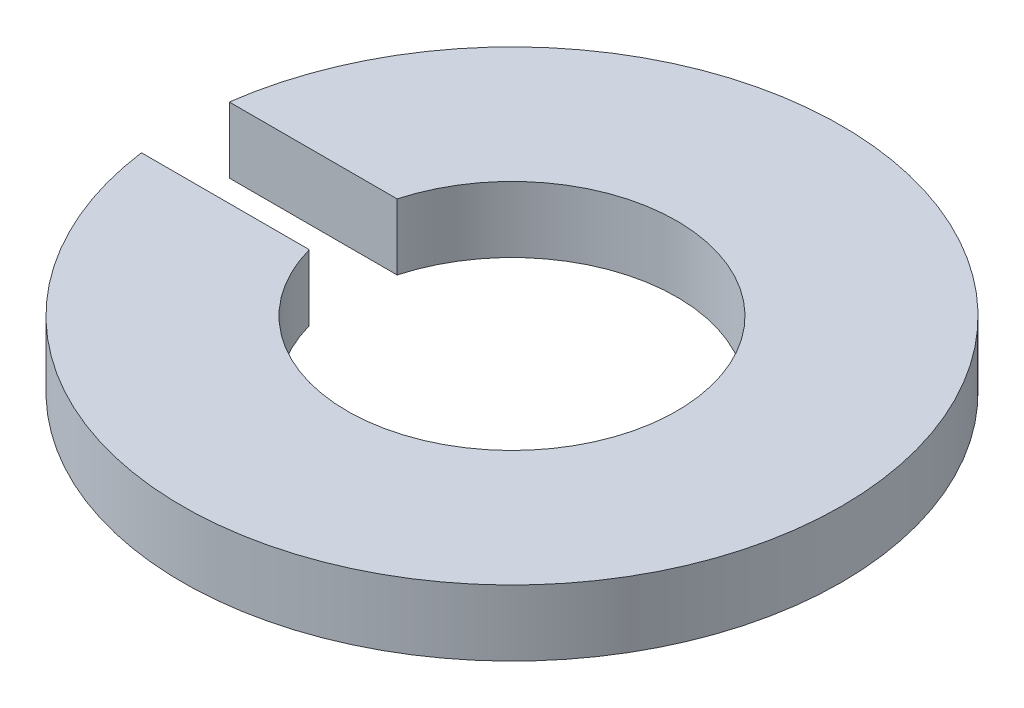
ISO-10303-21;
HEADER;
FILE_DESCRIPTION(('STEP AP214'),'2;1');
FILE_NAME('part.step','',(''),(''),'','','');
FILE_SCHEMA(('AUTOMOTIVE_DESIGN { 1 0 10303 214 1 1 1 1 }'));
ENDSEC;
DATA;
#1=APPLICATION_CONTEXT('core data for automotive mechanical design processes');
#2=APPLICATION_PROTOCOL_DEFINITION('international standard','automotive_design',2000,#1);
#3=PRODUCT_CONTEXT('',#1,'mechanical');
#4=PRODUCT('Part','Part','',(#3));
#5=PRODUCT_RELATED_PRODUCT_CATEGORY('part','',(#4));
#6=PRODUCT_DEFINITION_FORMATION('','',#4);
#7=PRODUCT_DEFINITION_CONTEXT('part definition',#1,'design');
#8=PRODUCT_DEFINITION('design','',#6,#7);
#9=PRODUCT_DEFINITION_SHAPE('','',#8);
#10=(LENGTH_UNIT() NAMED_UNIT(*) SI_UNIT(.MILLI.,.METRE.));
#11=(NAMED_UNIT(*) PLANE_ANGLE_UNIT() SI_UNIT($,.RADIAN.));
#12=(NAMED_UNIT(*) SI_UNIT($,.STERADIAN.) SOLID_ANGLE_UNIT());
#13=UNCERTAINTY_MEASURE_WITH_UNIT(LENGTH_MEASURE(1.E-05),#10,'distance_accuracy_value','');
#14=(GEOMETRIC_REPRESENTATION_CONTEXT(3) GLOBAL_UNCERTAINTY_ASSIGNED_CONTEXT((#13)) GLOBAL_UNIT_ASSIGNED_CONTEXT((#10,
#11,#12)) REPRESENTATION_CONTEXT('',''));
#15=CARTESIAN_POINT('',(0.,0.,0.));
#16=DIRECTION('',(0.,0.,1.));
#17=DIRECTION('',(1.,0.,0.));
#18=AXIS2_PLACEMENT_3D('',#15,#16,#17);
#19=CARTESIAN_POINT('',(0.,0.3,0.));
#20=DIRECTION('',(0.,1.,0.));
#21=DIRECTION('',(0.,0.,1.));
#22=AXIS2_PLACEMENT_3D('',#19,#20,#21);
#23=PLANE('',#22);
#24=DIRECTION('',(1.,0.,0.));
#25=VECTOR('',#24,1.);
#26=CARTESIAN_POINT('',(-0.698302288340183,0.3,0.2));
#27=LINE('',#26,#25);
#28=CARTESIAN_POINT('',(-1.48660687473185,0.3,0.2));
#29=VERTEX_POINT('',#28);
#30=CARTESIAN_POINT('',(-0.722841614740048,0.3,0.2));
#31=VERTEX_POINT('',#30);
#32=EDGE_CURVE('E56',#29,#31,#27,.T.);
#33=ORIENTED_EDGE('',*,*,#32,.F.);
#34=CARTESIAN_POINT('',(0.,0.3,0.));
#35=DIRECTION('',(0.,1.,0.));
#36=DIRECTION('',(0.,0.,1.));
#37=AXIS2_PLACEMENT_3D('',#34,#35,#36);
#38=CIRCLE('',#37,1.5);
#39=CARTESIAN_POINT('',(-1.48660687473185,0.3,-0.2));
#40=VERTEX_POINT('',#39);
#41=EDGE_CURVE('E79',#29,#40,#38,.T.);
#42=ORIENTED_EDGE('',*,*,#41,.T.);
#43=DIRECTION('',(-1.,0.,0.));
#44=VECTOR('',#43,1.);
#45=CARTESIAN_POINT('',(-0.698302288340183,0.3,-0.2));
#46=LINE('',#45,#44);
#47=CARTESIAN_POINT('',(-0.722841614740048,0.3,-0.2));
#48=VERTEX_POINT('',#47);
#49=EDGE_CURVE('E73',#48,#40,#46,.T.);
#50=ORIENTED_EDGE('',*,*,#49,.F.);
#51=CARTESIAN_POINT('',(0.,0.3,0.));
#52=DIRECTION('',(0.,1.,0.));
#53=DIRECTION('',(0.,0.,1.));
#54=AXIS2_PLACEMENT_3D('',#51,#52,#53);
#55=CIRCLE('',#54,0.75);
#56=EDGE_CURVE('E83',#31,#48,#55,.T.);
#57=ORIENTED_EDGE('',*,*,#56,.F.);
#58=EDGE_LOOP('',(#33,#42,#50,#57));
#59=FACE_BOUND('',#58,.T.);
#60=ADVANCED_FACE('F34',(#59),#23,.T.);
#61=CARTESIAN_POINT('',(0.,0.,0.));
#62=DIRECTION('',(0.,1.,0.));
#63=DIRECTION('',(0.,0.,1.));
#64=AXIS2_PLACEMENT_3D('',#61,#62,#63);
#65=PLANE('',#64);
#66=CARTESIAN_POINT('',(0.,0.,0.));
#67=DIRECTION('',(0.,1.,0.));
#68=DIRECTION('',(0.,0.,1.));
#69=AXIS2_PLACEMENT_3D('',#66,#67,#68);
#70=CIRCLE('',#69,1.5);
#71=CARTESIAN_POINT('',(-1.48660687473185,0.,0.2));
#72=VERTEX_POINT('',#71);
#73=CARTESIAN_POINT('',(-1.48660687473185,0.,-0.2));
#74=VERTEX_POINT('',#73);
#75=EDGE_CURVE('E87',#72,#74,#70,.T.);
#76=ORIENTED_EDGE('',*,*,#75,.F.);
#77=DIRECTION('',(1.,0.,0.));
#78=VECTOR('',#77,1.);
#79=CARTESIAN_POINT('',(-0.698302288340183,0.,0.2));
#80=LINE('',#79,#78);
#81=CARTESIAN_POINT('',(-0.722841614740048,0.,0.2));
#82=VERTEX_POINT('',#81);
#83=EDGE_CURVE('E100',#72,#82,#80,.T.);
#84=ORIENTED_EDGE('',*,*,#83,.T.);
#85=CARTESIAN_POINT('',(0.,0.,0.));
#86=DIRECTION('',(0.,1.,0.));
#87=DIRECTION('',(0.,0.,1.));
#88=AXIS2_PLACEMENT_3D('',#85,#86,#87);
#89=CIRCLE('',#88,0.75);
#90=CARTESIAN_POINT('',(-0.722841614740048,0.,-0.2));
#91=VERTEX_POINT('',#90);
#92=EDGE_CURVE('E88',#82,#91,#89,.T.);
#93=ORIENTED_EDGE('',*,*,#92,.T.);
#94=DIRECTION('',(-1.,0.,0.));
#95=VECTOR('',#94,1.);
#96=CARTESIAN_POINT('',(-0.698302288340183,0.,-0.2));
#97=LINE('',#96,#95);
#98=EDGE_CURVE('E49',#91,#74,#97,.T.);
#99=ORIENTED_EDGE('',*,*,#98,.T.);
#100=EDGE_LOOP('',(#76,#84,#93,#99));
#101=FACE_BOUND('',#100,.T.);
#102=ADVANCED_FACE('F106',(#101),#65,.F.);
#103=CARTESIAN_POINT('',(0.,0.3,0.));
#104=DIRECTION('',(0.,-1.,0.));
#105=DIRECTION('',(0.,0.,-1.));
#106=AXIS2_PLACEMENT_3D('',#103,#104,#105);
#107=CYLINDRICAL_SURFACE('',#106,1.5);
#108=ORIENTED_EDGE('',*,*,#41,.F.);
#109=DIRECTION('',(0.,-1.,0.));
#110=VECTOR('',#109,1.);
#111=CARTESIAN_POINT('',(-1.48660687473185,0.3,0.2));
#112=LINE('',#111,#110);
#113=EDGE_CURVE('E92',#29,#72,#112,.T.);
#114=ORIENTED_EDGE('',*,*,#113,.T.);
#115=ORIENTED_EDGE('',*,*,#75,.T.);
#116=DIRECTION('',(0.,-1.,0.));
#117=VECTOR('',#116,1.);
#118=CARTESIAN_POINT('',(-1.48660687473185,0.3,-0.2));
#119=LINE('',#118,#117);
#120=EDGE_CURVE('E98',#74,#40,#119,.F.);
#121=ORIENTED_EDGE('',*,*,#120,.T.);
#122=EDGE_LOOP('',(#108,#114,#115,#121));
#123=FACE_BOUND('',#122,.T.);
#124=ADVANCED_FACE('F36',(#123),#107,.T.);
#125=CARTESIAN_POINT('',(0.,0.3,0.));
#126=DIRECTION('',(0.,-1.,0.));
#127=DIRECTION('',(0.,0.,-1.));
#128=AXIS2_PLACEMENT_3D('',#125,#126,#127);
#129=CYLINDRICAL_SURFACE('',#128,0.75);
#130=DIRECTION('',(0.,-1.,0.));
#131=VECTOR('',#130,1.);
#132=CARTESIAN_POINT('',(-0.722841614740048,0.3,0.2));
#133=LINE('',#132,#131);
#134=EDGE_CURVE('E11',#31,#82,#133,.T.);
#135=ORIENTED_EDGE('',*,*,#134,.F.);
#136=ORIENTED_EDGE('',*,*,#56,.T.);
#137=DIRECTION('',(0.,-1.,0.));
#138=VECTOR('',#137,1.);
#139=CARTESIAN_POINT('',(-0.722841614740048,0.3,-0.2));
#140=LINE('',#139,#138);
#141=EDGE_CURVE('E42',#91,#48,#140,.F.);
#142=ORIENTED_EDGE('',*,*,#141,.F.);
#143=ORIENTED_EDGE('',*,*,#92,.F.);
#144=EDGE_LOOP('',(#135,#136,#142,#143));
#145=FACE_BOUND('',#144,.T.);
#146=ADVANCED_FACE('F86',(#145),#129,.F.);
#147=CARTESIAN_POINT('',(-0.698302288340183,0.,-0.2));
#148=DIRECTION('',(0.,0.,-1.));
#149=DIRECTION('',(-1.,0.,0.));
#150=AXIS2_PLACEMENT_3D('',#147,#148,#149);
#151=PLANE('',#150);
#152=ORIENTED_EDGE('',*,*,#98,.F.);
#153=ORIENTED_EDGE('',*,*,#141,.T.);
#154=ORIENTED_EDGE('',*,*,#49,.T.);
#155=ORIENTED_EDGE('',*,*,#120,.F.);
#156=EDGE_LOOP('',(#152,#153,#154,#155));
#157=FACE_BOUND('',#156,.T.);
#158=ADVANCED_FACE('F72',(#157),#151,.F.);
#159=CARTESIAN_POINT('',(-0.698302288340183,0.,0.2));
#160=DIRECTION('',(0.,0.,1.));
#161=DIRECTION('',(1.,0.,0.));
#162=AXIS2_PLACEMENT_3D('',#159,#160,#161);
#163=PLANE('',#162);
#164=ORIENTED_EDGE('',*,*,#32,.T.);
#165=ORIENTED_EDGE('',*,*,#134,.T.);
#166=ORIENTED_EDGE('',*,*,#83,.F.);
#167=ORIENTED_EDGE('',*,*,#113,.F.);
#168=EDGE_LOOP('',(#164,#165,#166,#167));
#169=FACE_BOUND('',#168,.T.);
#170=ADVANCED_FACE('F108',(#169),#163,.F.);
#171=CLOSED_SHELL('',(#60,#102,#124,#146,#158,#170));
#172=MANIFOLD_SOLID_BREP('B2',#171);
#173=ADVANCED_BREP_SHAPE_REPRESENTATION('',(#18,#172),#14);
#174=SHAPE_DEFINITION_REPRESENTATION(#9,#173);
ENDSEC;
END-ISO-10303-21;
